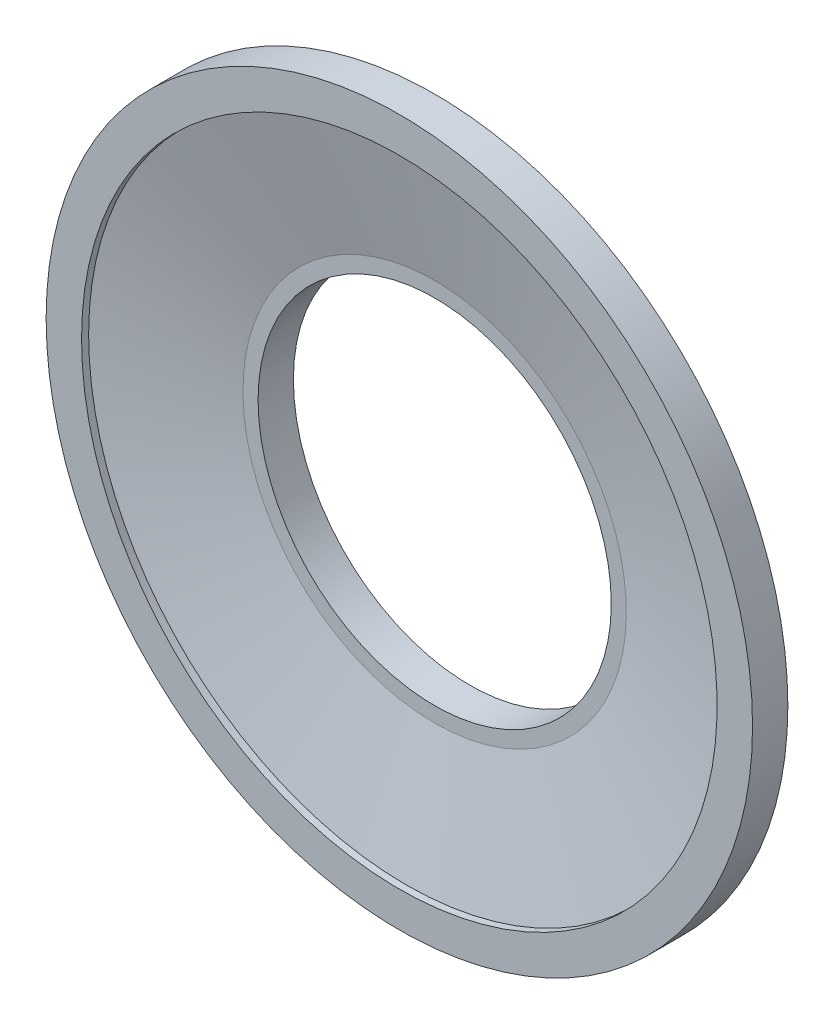
ISO-10303-21;
HEADER;
FILE_DESCRIPTION(('STEP AP214'),'2;1');
FILE_NAME('part.step','',(''),(''),'','','');
FILE_SCHEMA(('AUTOMOTIVE_DESIGN { 1 0 10303 214 1 1 1 1 }'));
ENDSEC;
DATA;
#1=APPLICATION_CONTEXT('core data for automotive mechanical design processes');
#2=APPLICATION_PROTOCOL_DEFINITION('international standard','automotive_design',2000,#1);
#3=PRODUCT_CONTEXT('',#1,'mechanical');
#4=PRODUCT('Part','Part','',(#3));
#5=PRODUCT_RELATED_PRODUCT_CATEGORY('part','',(#4));
#6=PRODUCT_DEFINITION_FORMATION('','',#4);
#7=PRODUCT_DEFINITION_CONTEXT('part definition',#1,'design');
#8=PRODUCT_DEFINITION('design','',#6,#7);
#9=PRODUCT_DEFINITION_SHAPE('','',#8);
#10=(LENGTH_UNIT() NAMED_UNIT(*) SI_UNIT(.MILLI.,.METRE.));
#11=(NAMED_UNIT(*) PLANE_ANGLE_UNIT() SI_UNIT($,.RADIAN.));
#12=(NAMED_UNIT(*) SI_UNIT($,.STERADIAN.) SOLID_ANGLE_UNIT());
#13=UNCERTAINTY_MEASURE_WITH_UNIT(LENGTH_MEASURE(1.E-05),#10,'distance_accuracy_value','');
#14=(GEOMETRIC_REPRESENTATION_CONTEXT(3) GLOBAL_UNCERTAINTY_ASSIGNED_CONTEXT((#13)) GLOBAL_UNIT_ASSIGNED_CONTEXT((#10,
#11,#12)) REPRESENTATION_CONTEXT('',''));
#15=CARTESIAN_POINT('',(0.,0.,0.));
#16=DIRECTION('',(0.,0.,1.));
#17=DIRECTION('',(1.,0.,0.));
#18=AXIS2_PLACEMENT_3D('',#15,#16,#17);
#19=CARTESIAN_POINT('',(0.,0.,-0.100000000017531));
#20=DIRECTION('',(0.,0.,1.));
#21=DIRECTION('',(0.,-1.,0.));
#22=AXIS2_PLACEMENT_3D('',#19,#20,#21);
#23=CONICAL_SURFACE('',#22,4.49843201556632,1.35033862822616);
#24=CARTESIAN_POINT('',(0.,0.,-0.50000000000386));
#25=DIRECTION('',(0.,0.,1.));
#26=DIRECTION('',(0.,-1.,0.));
#27=AXIS2_PLACEMENT_3D('',#24,#25,#26);
#28=CIRCLE('',#27,2.71351502067319);
#29=CARTESIAN_POINT('',(0.,-2.71351502067319,-0.50000000000386));
#30=VERTEX_POINT('',#29);
#31=EDGE_CURVE('E18',#30,#30,#28,.F.);
#32=ORIENTED_EDGE('',*,*,#31,.T.);
#33=EDGE_LOOP('',(#32));
#34=FACE_BOUND('',#33,.T.);
#35=CARTESIAN_POINT('',(0.,0.,-0.1));
#36=DIRECTION('',(0.,0.,-1.));
#37=DIRECTION('',(-1.,0.,0.));
#38=AXIS2_PLACEMENT_3D('',#35,#36,#37);
#39=CIRCLE('',#38,4.498432015619);
#40=CARTESIAN_POINT('',(-4.498432015619,0.,-0.1));
#41=VERTEX_POINT('',#40);
#42=EDGE_CURVE('E30',#41,#41,#39,.F.);
#43=ORIENTED_EDGE('',*,*,#42,.T.);
#44=EDGE_LOOP('',(#43));
#45=FACE_BOUND('',#44,.T.);
#46=ADVANCED_FACE('F15',(#34,#45),#23,.F.);
#47=CARTESIAN_POINT('',(0.,0.,-0.5));
#48=DIRECTION('',(0.,0.,-1.));
#49=DIRECTION('',(-1.,0.,0.));
#50=AXIS2_PLACEMENT_3D('',#47,#48,#49);
#51=PLANE('',#50);
#52=CARTESIAN_POINT('',(0.,0.,-0.5));
#53=DIRECTION('',(0.,0.,-1.));
#54=DIRECTION('',(-1.,0.,0.));
#55=AXIS2_PLACEMENT_3D('',#52,#53,#54);
#56=CIRCLE('',#55,2.5);
#57=CARTESIAN_POINT('',(-2.5,0.,-0.5));
#58=VERTEX_POINT('',#57);
#59=EDGE_CURVE('E32',#58,#58,#56,.T.);
#60=ORIENTED_EDGE('',*,*,#59,.T.);
#61=EDGE_LOOP('',(#60));
#62=FACE_BOUND('',#61,.T.);
#63=ORIENTED_EDGE('',*,*,#31,.F.);
#64=EDGE_LOOP('',(#63));
#65=FACE_BOUND('',#64,.T.);
#66=ADVANCED_FACE('F44',(#62,#65),#51,.F.);
#67=CARTESIAN_POINT('',(0.,0.,0.05));
#68=DIRECTION('',(0.,0.,-1.));
#69=DIRECTION('',(-1.,0.,0.));
#70=AXIS2_PLACEMENT_3D('',#67,#68,#69);
#71=CYLINDRICAL_SURFACE('',#70,4.498432015619);
#72=ORIENTED_EDGE('',*,*,#42,.F.);
#73=EDGE_LOOP('',(#72));
#74=FACE_BOUND('',#73,.T.);
#75=CARTESIAN_POINT('',(0.,0.,0.));
#76=DIRECTION('',(0.,0.,-1.));
#77=DIRECTION('',(-1.,0.,0.));
#78=AXIS2_PLACEMENT_3D('',#75,#76,#77);
#79=CIRCLE('',#78,4.498432015619);
#80=CARTESIAN_POINT('',(-4.498432015619,0.,0.));
#81=VERTEX_POINT('',#80);
#82=EDGE_CURVE('E39',#81,#81,#79,.F.);
#83=ORIENTED_EDGE('',*,*,#82,.T.);
#84=EDGE_LOOP('',(#83));
#85=FACE_BOUND('',#84,.T.);
#86=ADVANCED_FACE('F50',(#74,#85),#71,.F.);
#87=CARTESIAN_POINT('',(0.,0.,-1.));
#88=DIRECTION('',(0.,0.,-1.));
#89=DIRECTION('',(-1.,0.,0.));
#90=AXIS2_PLACEMENT_3D('',#87,#88,#89);
#91=CYLINDRICAL_SURFACE('',#90,2.5);
#92=CARTESIAN_POINT('',(0.,0.,-1.));
#93=DIRECTION('',(0.,0.,-1.));
#94=DIRECTION('',(-1.,0.,0.));
#95=AXIS2_PLACEMENT_3D('',#92,#93,#94);
#96=CIRCLE('',#95,2.5);
#97=CARTESIAN_POINT('',(-2.5,0.,-1.));
#98=VERTEX_POINT('',#97);
#99=EDGE_CURVE('E36',#98,#98,#96,.F.);
#100=ORIENTED_EDGE('',*,*,#99,.F.);
#101=EDGE_LOOP('',(#100));
#102=FACE_BOUND('',#101,.T.);
#103=ORIENTED_EDGE('',*,*,#59,.F.);
#104=EDGE_LOOP('',(#103));
#105=FACE_BOUND('',#104,.T.);
#106=ADVANCED_FACE('F47',(#102,#105),#91,.F.);
#107=CARTESIAN_POINT('',(0.,0.,0.));
#108=DIRECTION('',(0.,0.,-1.));
#109=DIRECTION('',(-1.,0.,0.));
#110=AXIS2_PLACEMENT_3D('',#107,#108,#109);
#111=PLANE('',#110);
#112=ORIENTED_EDGE('',*,*,#82,.F.);
#113=EDGE_LOOP('',(#112));
#114=FACE_BOUND('',#113,.T.);
#115=CARTESIAN_POINT('',(0.,0.,0.));
#116=DIRECTION('',(0.,0.,-1.));
#117=DIRECTION('',(-1.,0.,0.));
#118=AXIS2_PLACEMENT_3D('',#115,#116,#117);
#119=CIRCLE('',#118,5.);
#120=CARTESIAN_POINT('',(-5.,0.,0.));
#121=VERTEX_POINT('',#120);
#122=EDGE_CURVE('E27',#121,#121,#119,.T.);
#123=ORIENTED_EDGE('',*,*,#122,.F.);
#124=EDGE_LOOP('',(#123));
#125=FACE_BOUND('',#124,.T.);
#126=ADVANCED_FACE('F49',(#114,#125),#111,.F.);
#127=CARTESIAN_POINT('',(0.,0.,-1.));
#128=DIRECTION('',(0.,0.,-1.));
#129=DIRECTION('',(-1.,0.,0.));
#130=AXIS2_PLACEMENT_3D('',#127,#128,#129);
#131=PLANE('',#130);
#132=ORIENTED_EDGE('',*,*,#99,.T.);
#133=EDGE_LOOP('',(#132));
#134=FACE_BOUND('',#133,.T.);
#135=CARTESIAN_POINT('',(0.,0.,-0.999999999992036));
#136=DIRECTION('',(0.,0.,1.));
#137=DIRECTION('',(1.,0.,0.));
#138=AXIS2_PLACEMENT_3D('',#135,#136,#137);
#139=CIRCLE('',#138,2.76885375632219);
#140=CARTESIAN_POINT('',(2.76885375632219,0.,-0.999999999992036));
#141=VERTEX_POINT('',#140);
#142=EDGE_CURVE('E22',#141,#141,#139,.T.);
#143=ORIENTED_EDGE('',*,*,#142,.F.);
#144=EDGE_LOOP('',(#143));
#145=FACE_BOUND('',#144,.T.);
#146=ADVANCED_FACE('F58',(#134,#145),#131,.T.);
#147=CARTESIAN_POINT('',(0.,0.,0.05));
#148=DIRECTION('',(0.,0.,-1.));
#149=DIRECTION('',(-1.,0.,0.));
#150=AXIS2_PLACEMENT_3D('',#147,#148,#149);
#151=CYLINDRICAL_SURFACE('',#150,5.);
#152=ORIENTED_EDGE('',*,*,#122,.T.);
#153=EDGE_LOOP('',(#152));
#154=FACE_BOUND('',#153,.T.);
#155=CARTESIAN_POINT('',(0.,0.,-0.499999999988177));
#156=DIRECTION('',(0.,0.,1.));
#157=DIRECTION('',(-1.,0.,0.));
#158=AXIS2_PLACEMENT_3D('',#155,#156,#157);
#159=CIRCLE('',#158,4.99999999999545);
#160=CARTESIAN_POINT('',(-4.99999999999545,0.,-0.499999999988177));
#161=VERTEX_POINT('',#160);
#162=EDGE_CURVE('E10',#161,#161,#159,.F.);
#163=ORIENTED_EDGE('',*,*,#162,.F.);
#164=EDGE_LOOP('',(#163));
#165=FACE_BOUND('',#164,.T.);
#166=ADVANCED_FACE('F66',(#154,#165),#151,.T.);
#167=CARTESIAN_POINT('',(0.,0.,-0.499999999988177));
#168=DIRECTION('',(0.,0.,1.));
#169=DIRECTION('',(1.,0.,0.));
#170=AXIS2_PLACEMENT_3D('',#167,#168,#169);
#171=CONICAL_SURFACE('',#170,4.99999999999545,1.35033862822265);
#172=ORIENTED_EDGE('',*,*,#162,.T.);
#173=EDGE_LOOP('',(#172));
#174=FACE_BOUND('',#173,.T.);
#175=ORIENTED_EDGE('',*,*,#142,.T.);
#176=EDGE_LOOP('',(#175));
#177=FACE_BOUND('',#176,.T.);
#178=ADVANCED_FACE('F64',(#174,#177),#171,.T.);
#179=CLOSED_SHELL('',(#46,#66,#86,#106,#126,#146,#166,#178));
#180=MANIFOLD_SOLID_BREP('B1',#179);
#181=ADVANCED_BREP_SHAPE_REPRESENTATION('',(#18,#180),#14);
#182=SHAPE_DEFINITION_REPRESENTATION(#9,#181);
ENDSEC;
END-ISO-10303-21;
